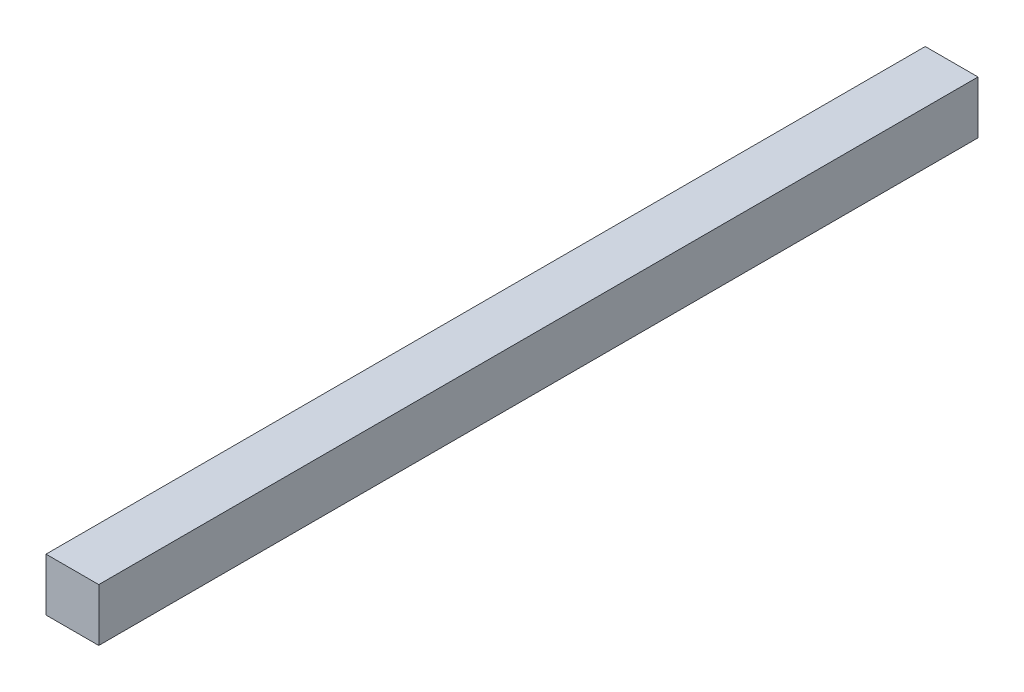
ISO-10303-21;
HEADER;
FILE_DESCRIPTION(('STEP AP214'),'2;1');
FILE_NAME('part.step','',(''),(''),'','','');
FILE_SCHEMA(('AUTOMOTIVE_DESIGN { 1 0 10303 214 1 1 1 1 }'));
ENDSEC;
DATA;
#1=APPLICATION_CONTEXT('core data for automotive mechanical design processes');
#2=APPLICATION_PROTOCOL_DEFINITION('international standard','automotive_design',2000,#1);
#3=PRODUCT_CONTEXT('',#1,'mechanical');
#4=PRODUCT('Part','Part','',(#3));
#5=PRODUCT_RELATED_PRODUCT_CATEGORY('part','',(#4));
#6=PRODUCT_DEFINITION_FORMATION('','',#4);
#7=PRODUCT_DEFINITION_CONTEXT('part definition',#1,'design');
#8=PRODUCT_DEFINITION('design','',#6,#7);
#9=PRODUCT_DEFINITION_SHAPE('','',#8);
#10=(LENGTH_UNIT() NAMED_UNIT(*) SI_UNIT(.MILLI.,.METRE.));
#11=(NAMED_UNIT(*) PLANE_ANGLE_UNIT() SI_UNIT($,.RADIAN.));
#12=(NAMED_UNIT(*) SI_UNIT($,.STERADIAN.) SOLID_ANGLE_UNIT());
#13=UNCERTAINTY_MEASURE_WITH_UNIT(LENGTH_MEASURE(1.E-05),#10,'distance_accuracy_value','');
#14=(GEOMETRIC_REPRESENTATION_CONTEXT(3) GLOBAL_UNCERTAINTY_ASSIGNED_CONTEXT((#13)) GLOBAL_UNIT_ASSIGNED_CONTEXT((#10,
#11,#12)) REPRESENTATION_CONTEXT('',''));
#15=CARTESIAN_POINT('',(0.,0.,0.));
#16=DIRECTION('',(0.,0.,1.));
#17=DIRECTION('',(1.,0.,0.));
#18=AXIS2_PLACEMENT_3D('',#15,#16,#17);
#19=CARTESIAN_POINT('',(18.,-8.99999999999999,325.455844122716));
#20=DIRECTION('',(-1.,0.,0.));
#21=DIRECTION('',(0.,0.,1.));
#22=AXIS2_PLACEMENT_3D('',#19,#20,#21);
#23=PLANE('',#22);
#24=DIRECTION('',(0.,1.,0.));
#25=VECTOR('',#24,1.);
#26=CARTESIAN_POINT('',(18.,-8.99999999999999,300.));
#27=LINE('',#26,#25);
#28=CARTESIAN_POINT('',(18.,-9.00000000000005,300.));
#29=VERTEX_POINT('',#28);
#30=CARTESIAN_POINT('',(18.,8.99999999999995,300.));
#31=VERTEX_POINT('',#30);
#32=EDGE_CURVE('E41',#29,#31,#27,.T.);
#33=ORIENTED_EDGE('',*,*,#32,.F.);
#34=DIRECTION('',(0.,0.,-1.));
#35=VECTOR('',#34,1.);
#36=CARTESIAN_POINT('',(18.,-8.99999999999999,325.455844122716));
#37=LINE('',#36,#35);
#38=CARTESIAN_POINT('',(18.,-8.99999999999999,0.));
#39=VERTEX_POINT('',#38);
#40=EDGE_CURVE('E97',#29,#39,#37,.T.);
#41=ORIENTED_EDGE('',*,*,#40,.T.);
#42=DIRECTION('',(0.,1.,0.));
#43=VECTOR('',#42,1.);
#44=CARTESIAN_POINT('',(18.,-8.99999999999999,0.));
#45=LINE('',#44,#43);
#46=CARTESIAN_POINT('',(18.,9.00000000000001,0.));
#47=VERTEX_POINT('',#46);
#48=EDGE_CURVE('E88',#39,#47,#45,.T.);
#49=ORIENTED_EDGE('',*,*,#48,.T.);
#50=DIRECTION('',(0.,0.,-1.));
#51=VECTOR('',#50,1.);
#52=CARTESIAN_POINT('',(18.,9.00000000000001,325.455844122716));
#53=LINE('',#52,#51);
#54=EDGE_CURVE('E79',#31,#47,#53,.T.);
#55=ORIENTED_EDGE('',*,*,#54,.F.);
#56=EDGE_LOOP('',(#33,#41,#49,#55));
#57=FACE_BOUND('',#56,.T.);
#58=ADVANCED_FACE('F37',(#57),#23,.F.);
#59=CARTESIAN_POINT('',(18.,9.00000000000001,325.455844122716));
#60=DIRECTION('',(0.,-1.,0.));
#61=DIRECTION('',(0.,0.,-1.));
#62=AXIS2_PLACEMENT_3D('',#59,#60,#61);
#63=PLANE('',#62);
#64=DIRECTION('',(-1.,0.,0.));
#65=VECTOR('',#64,1.);
#66=CARTESIAN_POINT('',(18.,9.00000000000001,300.));
#67=LINE('',#66,#65);
#68=CARTESIAN_POINT('',(0.,8.99999999999995,300.));
#69=VERTEX_POINT('',#68);
#70=EDGE_CURVE('E85',#31,#69,#67,.T.);
#71=ORIENTED_EDGE('',*,*,#70,.F.);
#72=ORIENTED_EDGE('',*,*,#54,.T.);
#73=DIRECTION('',(-1.,0.,0.));
#74=VECTOR('',#73,1.);
#75=CARTESIAN_POINT('',(18.,9.00000000000001,0.));
#76=LINE('',#75,#74);
#77=CARTESIAN_POINT('',(0.,9.00000000000001,0.));
#78=VERTEX_POINT('',#77);
#79=EDGE_CURVE('E82',#47,#78,#76,.T.);
#80=ORIENTED_EDGE('',*,*,#79,.T.);
#81=DIRECTION('',(0.,0.,-1.));
#82=VECTOR('',#81,1.);
#83=CARTESIAN_POINT('',(0.,9.00000000000001,325.455844122716));
#84=LINE('',#83,#82);
#85=EDGE_CURVE('E73',#69,#78,#84,.T.);
#86=ORIENTED_EDGE('',*,*,#85,.F.);
#87=EDGE_LOOP('',(#71,#72,#80,#86));
#88=FACE_BOUND('',#87,.T.);
#89=ADVANCED_FACE('F81',(#88),#63,.F.);
#90=CARTESIAN_POINT('',(0.,-8.99999999999999,325.455844122716));
#91=DIRECTION('',(1.,0.,0.));
#92=DIRECTION('',(0.,0.,-1.));
#93=AXIS2_PLACEMENT_3D('',#90,#91,#92);
#94=PLANE('',#93);
#95=DIRECTION('',(0.,-1.,0.));
#96=VECTOR('',#95,1.);
#97=CARTESIAN_POINT('',(0.,-8.99999999999999,300.));
#98=LINE('',#97,#96);
#99=CARTESIAN_POINT('',(0.,-8.99999999999999,300.));
#100=VERTEX_POINT('',#99);
#101=EDGE_CURVE('E47',#69,#100,#98,.T.);
#102=ORIENTED_EDGE('',*,*,#101,.F.);
#103=ORIENTED_EDGE('',*,*,#85,.T.);
#104=DIRECTION('',(0.,-1.,0.));
#105=VECTOR('',#104,1.);
#106=CARTESIAN_POINT('',(0.,-8.99999999999999,0.));
#107=LINE('',#106,#105);
#108=CARTESIAN_POINT('',(0.,-8.99999999999999,0.));
#109=VERTEX_POINT('',#108);
#110=EDGE_CURVE('E94',#78,#109,#107,.T.);
#111=ORIENTED_EDGE('',*,*,#110,.T.);
#112=DIRECTION('',(0.,0.,-1.));
#113=VECTOR('',#112,1.);
#114=CARTESIAN_POINT('',(0.,-8.99999999999999,325.455844122716));
#115=LINE('',#114,#113);
#116=EDGE_CURVE('E103',#100,#109,#115,.T.);
#117=ORIENTED_EDGE('',*,*,#116,.F.);
#118=EDGE_LOOP('',(#102,#103,#111,#117));
#119=FACE_BOUND('',#118,.T.);
#120=ADVANCED_FACE('F112',(#119),#94,.F.);
#121=CARTESIAN_POINT('',(18.,-8.99999999999999,325.455844122716));
#122=DIRECTION('',(0.,1.,0.));
#123=DIRECTION('',(0.,0.,1.));
#124=AXIS2_PLACEMENT_3D('',#121,#122,#123);
#125=PLANE('',#124);
#126=DIRECTION('',(1.,0.,0.));
#127=VECTOR('',#126,1.);
#128=CARTESIAN_POINT('',(18.,-8.99999999999999,300.));
#129=LINE('',#128,#127);
#130=EDGE_CURVE('E11',#100,#29,#129,.T.);
#131=ORIENTED_EDGE('',*,*,#130,.F.);
#132=ORIENTED_EDGE('',*,*,#116,.T.);
#133=DIRECTION('',(1.,0.,0.));
#134=VECTOR('',#133,1.);
#135=CARTESIAN_POINT('',(18.,-8.99999999999999,0.));
#136=LINE('',#135,#134);
#137=EDGE_CURVE('E104',#109,#39,#136,.T.);
#138=ORIENTED_EDGE('',*,*,#137,.T.);
#139=ORIENTED_EDGE('',*,*,#40,.F.);
#140=EDGE_LOOP('',(#131,#132,#138,#139));
#141=FACE_BOUND('',#140,.T.);
#142=ADVANCED_FACE('F110',(#141),#125,.F.);
#143=CARTESIAN_POINT('',(0.,0.,0.));
#144=DIRECTION('',(0.,0.,1.));
#145=DIRECTION('',(1.,0.,0.));
#146=AXIS2_PLACEMENT_3D('',#143,#144,#145);
#147=PLANE('',#146);
#148=ORIENTED_EDGE('',*,*,#48,.F.);
#149=ORIENTED_EDGE('',*,*,#137,.F.);
#150=ORIENTED_EDGE('',*,*,#110,.F.);
#151=ORIENTED_EDGE('',*,*,#79,.F.);
#152=EDGE_LOOP('',(#148,#149,#150,#151));
#153=FACE_BOUND('',#152,.T.);
#154=ADVANCED_FACE('F92',(#153),#147,.F.);
#155=CARTESIAN_POINT('',(500.,-9.00000000000005,300.));
#156=DIRECTION('',(0.,0.,1.));
#157=DIRECTION('',(1.,0.,0.));
#158=AXIS2_PLACEMENT_3D('',#155,#156,#157);
#159=PLANE('',#158);
#160=ORIENTED_EDGE('',*,*,#32,.T.);
#161=ORIENTED_EDGE('',*,*,#70,.T.);
#162=ORIENTED_EDGE('',*,*,#101,.T.);
#163=ORIENTED_EDGE('',*,*,#130,.T.);
#164=EDGE_LOOP('',(#160,#161,#162,#163));
#165=FACE_BOUND('',#164,.T.);
#166=ADVANCED_FACE('F39',(#165),#159,.T.);
#167=CLOSED_SHELL('',(#58,#89,#120,#142,#154,#166));
#168=MANIFOLD_SOLID_BREP('B2',#167);
#169=ADVANCED_BREP_SHAPE_REPRESENTATION('',(#18,#168),#14);
#170=SHAPE_DEFINITION_REPRESENTATION(#9,#169);
ENDSEC;
END-ISO-10303-21;
